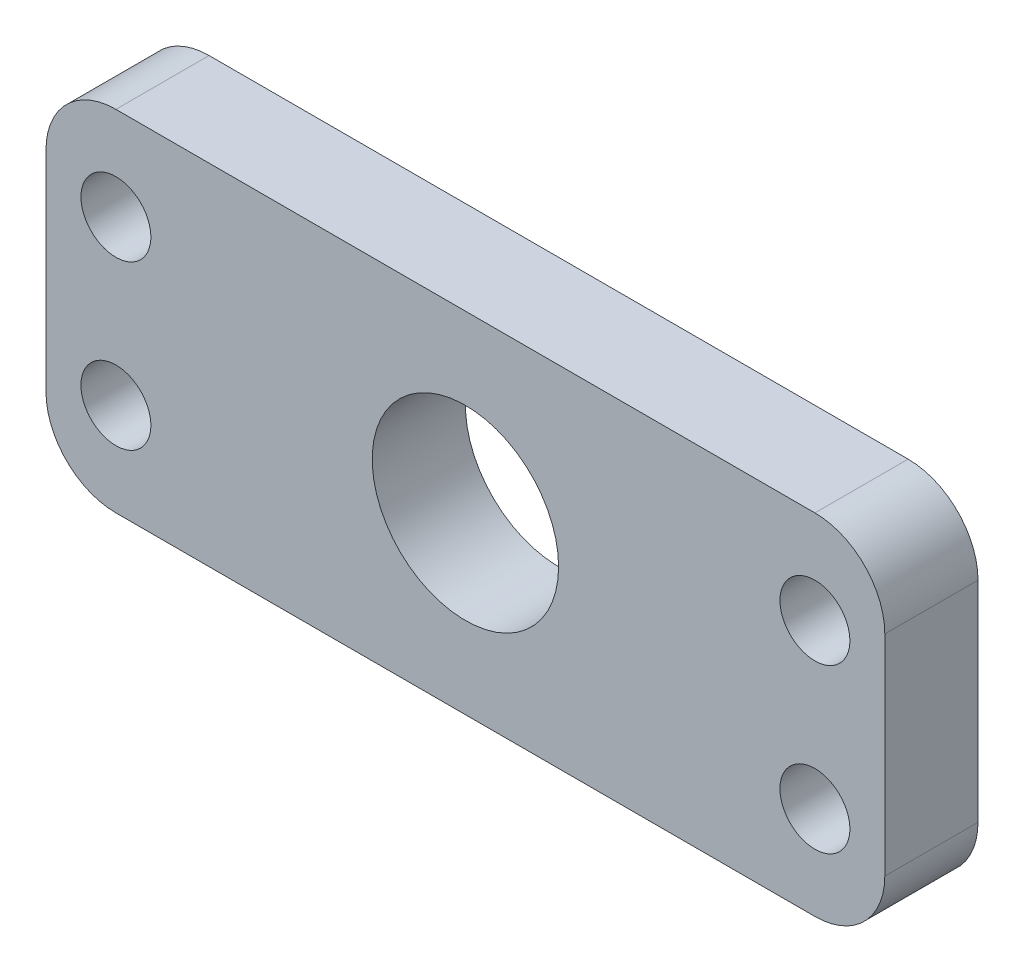
ISO-10303-21;
HEADER;
FILE_DESCRIPTION(('STEP AP214'),'2;1');
FILE_NAME('part.step','',(''),(''),'','','');
FILE_SCHEMA(('AUTOMOTIVE_DESIGN { 1 0 10303 214 1 1 1 1 }'));
ENDSEC;
DATA;
#1=APPLICATION_CONTEXT('core data for automotive mechanical design processes');
#2=APPLICATION_PROTOCOL_DEFINITION('international standard','automotive_design',2000,#1);
#3=PRODUCT_CONTEXT('',#1,'mechanical');
#4=PRODUCT('Part','Part','',(#3));
#5=PRODUCT_RELATED_PRODUCT_CATEGORY('part','',(#4));
#6=PRODUCT_DEFINITION_FORMATION('','',#4);
#7=PRODUCT_DEFINITION_CONTEXT('part definition',#1,'design');
#8=PRODUCT_DEFINITION('design','',#6,#7);
#9=PRODUCT_DEFINITION_SHAPE('','',#8);
#10=(LENGTH_UNIT() NAMED_UNIT(*) SI_UNIT(.MILLI.,.METRE.));
#11=(NAMED_UNIT(*) PLANE_ANGLE_UNIT() SI_UNIT($,.RADIAN.));
#12=(NAMED_UNIT(*) SI_UNIT($,.STERADIAN.) SOLID_ANGLE_UNIT());
#13=UNCERTAINTY_MEASURE_WITH_UNIT(LENGTH_MEASURE(1.E-05),#10,'distance_accuracy_value','');
#14=(GEOMETRIC_REPRESENTATION_CONTEXT(3) GLOBAL_UNCERTAINTY_ASSIGNED_CONTEXT((#13)) GLOBAL_UNIT_ASSIGNED_CONTEXT((#10,
#11,#12)) REPRESENTATION_CONTEXT('',''));
#15=CARTESIAN_POINT('',(0.,0.,0.));
#16=DIRECTION('',(0.,0.,1.));
#17=DIRECTION('',(1.,0.,0.));
#18=AXIS2_PLACEMENT_3D('',#15,#16,#17);
#19=CARTESIAN_POINT('',(-18.,-7.5,4.));
#20=DIRECTION('',(1.,0.,0.));
#21=DIRECTION('',(0.,0.,-1.));
#22=AXIS2_PLACEMENT_3D('',#19,#20,#21);
#23=PLANE('',#22);
#24=DIRECTION('',(0.,-1.,0.));
#25=VECTOR('',#24,1.);
#26=CARTESIAN_POINT('',(-18.,-7.5,0.));
#27=LINE('',#26,#25);
#28=CARTESIAN_POINT('',(-18.,4.49999999999999,0.));
#29=VERTEX_POINT('',#28);
#30=CARTESIAN_POINT('',(-18.,-4.5,0.));
#31=VERTEX_POINT('',#30);
#32=EDGE_CURVE('E141',#29,#31,#27,.T.);
#33=ORIENTED_EDGE('',*,*,#32,.T.);
#34=DIRECTION('',(0.,0.,-1.));
#35=VECTOR('',#34,1.);
#36=CARTESIAN_POINT('',(-18.,-4.5,4.));
#37=LINE('',#36,#35);
#38=CARTESIAN_POINT('',(-18.,-4.5,4.));
#39=VERTEX_POINT('',#38);
#40=EDGE_CURVE('E11',#31,#39,#37,.F.);
#41=ORIENTED_EDGE('',*,*,#40,.T.);
#42=DIRECTION('',(0.,-1.,0.));
#43=VECTOR('',#42,1.);
#44=CARTESIAN_POINT('',(-18.,-7.5,4.));
#45=LINE('',#44,#43);
#46=CARTESIAN_POINT('',(-18.,4.49999999999999,4.));
#47=VERTEX_POINT('',#46);
#48=EDGE_CURVE('E139',#47,#39,#45,.T.);
#49=ORIENTED_EDGE('',*,*,#48,.F.);
#50=DIRECTION('',(0.,0.,-1.));
#51=VECTOR('',#50,1.);
#52=CARTESIAN_POINT('',(-18.,4.5,4.));
#53=LINE('',#52,#51);
#54=EDGE_CURVE('E48',#47,#29,#53,.T.);
#55=ORIENTED_EDGE('',*,*,#54,.T.);
#56=EDGE_LOOP('',(#33,#41,#49,#55));
#57=FACE_BOUND('',#56,.T.);
#58=ADVANCED_FACE('F39',(#57),#23,.F.);
#59=CARTESIAN_POINT('',(-18.,-7.5,4.));
#60=DIRECTION('',(0.,1.,0.));
#61=DIRECTION('',(0.,0.,1.));
#62=AXIS2_PLACEMENT_3D('',#59,#60,#61);
#63=PLANE('',#62);
#64=DIRECTION('',(1.,0.,0.));
#65=VECTOR('',#64,1.);
#66=CARTESIAN_POINT('',(-18.,-7.5,0.));
#67=LINE('',#66,#65);
#68=CARTESIAN_POINT('',(-15.,-7.5,0.));
#69=VERTEX_POINT('',#68);
#70=CARTESIAN_POINT('',(15.,-7.5,0.));
#71=VERTEX_POINT('',#70);
#72=EDGE_CURVE('E135',#69,#71,#67,.T.);
#73=ORIENTED_EDGE('',*,*,#72,.T.);
#74=DIRECTION('',(0.,0.,-1.));
#75=VECTOR('',#74,1.);
#76=CARTESIAN_POINT('',(15.,-7.5,4.));
#77=LINE('',#76,#75);
#78=CARTESIAN_POINT('',(15.,-7.5,4.));
#79=VERTEX_POINT('',#78);
#80=EDGE_CURVE('E111',#71,#79,#77,.F.);
#81=ORIENTED_EDGE('',*,*,#80,.T.);
#82=DIRECTION('',(1.,0.,0.));
#83=VECTOR('',#82,1.);
#84=CARTESIAN_POINT('',(-18.,-7.5,4.));
#85=LINE('',#84,#83);
#86=CARTESIAN_POINT('',(-15.,-7.5,4.));
#87=VERTEX_POINT('',#86);
#88=EDGE_CURVE('E198',#87,#79,#85,.T.);
#89=ORIENTED_EDGE('',*,*,#88,.F.);
#90=DIRECTION('',(0.,0.,-1.));
#91=VECTOR('',#90,1.);
#92=CARTESIAN_POINT('',(-15.,-7.5,4.));
#93=LINE('',#92,#91);
#94=EDGE_CURVE('E117',#87,#69,#93,.T.);
#95=ORIENTED_EDGE('',*,*,#94,.T.);
#96=EDGE_LOOP('',(#73,#81,#89,#95));
#97=FACE_BOUND('',#96,.T.);
#98=ADVANCED_FACE('F273',(#97),#63,.F.);
#99=CARTESIAN_POINT('',(18.,-7.5,4.));
#100=DIRECTION('',(-1.,0.,0.));
#101=DIRECTION('',(0.,0.,1.));
#102=AXIS2_PLACEMENT_3D('',#99,#100,#101);
#103=PLANE('',#102);
#104=DIRECTION('',(0.,1.,0.));
#105=VECTOR('',#104,1.);
#106=CARTESIAN_POINT('',(18.,-7.5,4.));
#107=LINE('',#106,#105);
#108=CARTESIAN_POINT('',(18.,-4.5,4.));
#109=VERTEX_POINT('',#108);
#110=CARTESIAN_POINT('',(18.,4.49999999999999,4.));
#111=VERTEX_POINT('',#110);
#112=EDGE_CURVE('E126',#109,#111,#107,.T.);
#113=ORIENTED_EDGE('',*,*,#112,.F.);
#114=DIRECTION('',(0.,0.,-1.));
#115=VECTOR('',#114,1.);
#116=CARTESIAN_POINT('',(18.,-4.5,4.));
#117=LINE('',#116,#115);
#118=CARTESIAN_POINT('',(18.,-4.5,0.));
#119=VERTEX_POINT('',#118);
#120=EDGE_CURVE('E110',#109,#119,#117,.T.);
#121=ORIENTED_EDGE('',*,*,#120,.T.);
#122=DIRECTION('',(0.,1.,0.));
#123=VECTOR('',#122,1.);
#124=CARTESIAN_POINT('',(18.,-7.5,0.));
#125=LINE('',#124,#123);
#126=CARTESIAN_POINT('',(18.,4.49999999999999,0.));
#127=VERTEX_POINT('',#126);
#128=EDGE_CURVE('E124',#119,#127,#125,.T.);
#129=ORIENTED_EDGE('',*,*,#128,.T.);
#130=DIRECTION('',(0.,0.,-1.));
#131=VECTOR('',#130,1.);
#132=CARTESIAN_POINT('',(18.,4.5,4.));
#133=LINE('',#132,#131);
#134=EDGE_CURVE('E129',#127,#111,#133,.F.);
#135=ORIENTED_EDGE('',*,*,#134,.T.);
#136=EDGE_LOOP('',(#113,#121,#129,#135));
#137=FACE_BOUND('',#136,.T.);
#138=ADVANCED_FACE('F123',(#137),#103,.F.);
#139=CARTESIAN_POINT('',(-18.,7.5,4.));
#140=DIRECTION('',(0.,-1.,0.));
#141=DIRECTION('',(0.,0.,-1.));
#142=AXIS2_PLACEMENT_3D('',#139,#140,#141);
#143=PLANE('',#142);
#144=DIRECTION('',(-1.,0.,0.));
#145=VECTOR('',#144,1.);
#146=CARTESIAN_POINT('',(-18.,7.5,4.));
#147=LINE('',#146,#145);
#148=CARTESIAN_POINT('',(15.,7.5,4.));
#149=VERTEX_POINT('',#148);
#150=CARTESIAN_POINT('',(-15.,7.5,4.));
#151=VERTEX_POINT('',#150);
#152=EDGE_CURVE('E146',#149,#151,#147,.T.);
#153=ORIENTED_EDGE('',*,*,#152,.F.);
#154=DIRECTION('',(0.,0.,-1.));
#155=VECTOR('',#154,1.);
#156=CARTESIAN_POINT('',(15.,7.5,4.));
#157=LINE('',#156,#155);
#158=CARTESIAN_POINT('',(15.,7.5,0.));
#159=VERTEX_POINT('',#158);
#160=EDGE_CURVE('E173',#149,#159,#157,.T.);
#161=ORIENTED_EDGE('',*,*,#160,.T.);
#162=DIRECTION('',(-1.,0.,0.));
#163=VECTOR('',#162,1.);
#164=CARTESIAN_POINT('',(-18.,7.5,0.));
#165=LINE('',#164,#163);
#166=CARTESIAN_POINT('',(-15.,7.5,0.));
#167=VERTEX_POINT('',#166);
#168=EDGE_CURVE('E134',#159,#167,#165,.T.);
#169=ORIENTED_EDGE('',*,*,#168,.T.);
#170=DIRECTION('',(0.,0.,-1.));
#171=VECTOR('',#170,1.);
#172=CARTESIAN_POINT('',(-15.,7.5,4.));
#173=LINE('',#172,#171);
#174=EDGE_CURVE('E55',#167,#151,#173,.F.);
#175=ORIENTED_EDGE('',*,*,#174,.T.);
#176=EDGE_LOOP('',(#153,#161,#169,#175));
#177=FACE_BOUND('',#176,.T.);
#178=ADVANCED_FACE('F266',(#177),#143,.F.);
#179=CARTESIAN_POINT('',(0.,0.,4.));
#180=DIRECTION('',(0.,0.,-1.));
#181=DIRECTION('',(-1.,0.,0.));
#182=AXIS2_PLACEMENT_3D('',#179,#180,#181);
#183=PLANE('',#182);
#184=CARTESIAN_POINT('',(15.,-3.5,4.));
#185=DIRECTION('',(0.,0.,-1.));
#186=DIRECTION('',(-1.,0.,0.));
#187=AXIS2_PLACEMENT_3D('',#184,#185,#186);
#188=CIRCLE('',#187,1.5);
#189=CARTESIAN_POINT('',(13.5,-3.5,4.));
#190=VERTEX_POINT('',#189);
#191=EDGE_CURVE('E220',#190,#190,#188,.T.);
#192=ORIENTED_EDGE('',*,*,#191,.T.);
#193=EDGE_LOOP('',(#192));
#194=FACE_BOUND('',#193,.T.);
#195=CARTESIAN_POINT('',(15.,3.5,4.));
#196=DIRECTION('',(0.,0.,-1.));
#197=DIRECTION('',(-1.,0.,0.));
#198=AXIS2_PLACEMENT_3D('',#195,#196,#197);
#199=CIRCLE('',#198,1.5);
#200=CARTESIAN_POINT('',(13.5,3.5,4.));
#201=VERTEX_POINT('',#200);
#202=EDGE_CURVE('E228',#201,#201,#199,.T.);
#203=ORIENTED_EDGE('',*,*,#202,.T.);
#204=EDGE_LOOP('',(#203));
#205=FACE_BOUND('',#204,.T.);
#206=CARTESIAN_POINT('',(-15.,3.5,4.));
#207=DIRECTION('',(0.,0.,-1.));
#208=DIRECTION('',(-1.,0.,0.));
#209=AXIS2_PLACEMENT_3D('',#206,#207,#208);
#210=CIRCLE('',#209,1.5);
#211=CARTESIAN_POINT('',(-16.5,3.5,4.));
#212=VERTEX_POINT('',#211);
#213=EDGE_CURVE('E212',#212,#212,#210,.T.);
#214=ORIENTED_EDGE('',*,*,#213,.T.);
#215=EDGE_LOOP('',(#214));
#216=FACE_BOUND('',#215,.T.);
#217=CARTESIAN_POINT('',(-15.,-3.5,4.));
#218=DIRECTION('',(0.,0.,-1.));
#219=DIRECTION('',(-1.,0.,0.));
#220=AXIS2_PLACEMENT_3D('',#217,#218,#219);
#221=CIRCLE('',#220,1.5);
#222=CARTESIAN_POINT('',(-16.5,-3.5,4.));
#223=VERTEX_POINT('',#222);
#224=EDGE_CURVE('E206',#223,#223,#221,.T.);
#225=ORIENTED_EDGE('',*,*,#224,.T.);
#226=EDGE_LOOP('',(#225));
#227=FACE_BOUND('',#226,.T.);
#228=CARTESIAN_POINT('',(0.,0.,4.));
#229=DIRECTION('',(0.,0.,1.));
#230=DIRECTION('',(1.,0.,0.));
#231=AXIS2_PLACEMENT_3D('',#228,#229,#230);
#232=CIRCLE('',#231,4.);
#233=CARTESIAN_POINT('',(4.,0.,4.));
#234=VERTEX_POINT('',#233);
#235=EDGE_CURVE('E191',#234,#234,#232,.T.);
#236=ORIENTED_EDGE('',*,*,#235,.F.);
#237=EDGE_LOOP('',(#236));
#238=FACE_BOUND('',#237,.T.);
#239=ORIENTED_EDGE('',*,*,#88,.T.);
#240=CARTESIAN_POINT('',(15.,-4.5,4.));
#241=DIRECTION('',(0.,0.,-1.));
#242=DIRECTION('',(-1.,0.,0.));
#243=AXIS2_PLACEMENT_3D('',#240,#241,#242);
#244=CIRCLE('',#243,3.);
#245=EDGE_CURVE('E168',#79,#109,#244,.F.);
#246=ORIENTED_EDGE('',*,*,#245,.T.);
#247=ORIENTED_EDGE('',*,*,#112,.T.);
#248=CARTESIAN_POINT('',(15.,4.5,4.));
#249=DIRECTION('',(0.,0.,-1.));
#250=DIRECTION('',(-1.,0.,0.));
#251=AXIS2_PLACEMENT_3D('',#248,#249,#250);
#252=CIRCLE('',#251,3.);
#253=EDGE_CURVE('E62',#111,#149,#252,.F.);
#254=ORIENTED_EDGE('',*,*,#253,.T.);
#255=ORIENTED_EDGE('',*,*,#152,.T.);
#256=CARTESIAN_POINT('',(-15.,4.5,4.));
#257=DIRECTION('',(0.,0.,-1.));
#258=DIRECTION('',(-1.,0.,0.));
#259=AXIS2_PLACEMENT_3D('',#256,#257,#258);
#260=CIRCLE('',#259,3.);
#261=EDGE_CURVE('E160',#151,#47,#260,.F.);
#262=ORIENTED_EDGE('',*,*,#261,.T.);
#263=ORIENTED_EDGE('',*,*,#48,.T.);
#264=CARTESIAN_POINT('',(-15.,-4.5,4.));
#265=DIRECTION('',(0.,0.,-1.));
#266=DIRECTION('',(-1.,0.,0.));
#267=AXIS2_PLACEMENT_3D('',#264,#265,#266);
#268=CIRCLE('',#267,3.);
#269=EDGE_CURVE('E163',#39,#87,#268,.F.);
#270=ORIENTED_EDGE('',*,*,#269,.T.);
#271=EDGE_LOOP('',(#239,#246,#247,#254,#255,#262,#263,#270));
#272=FACE_BOUND('',#271,.T.);
#273=ADVANCED_FACE('F240',(#194,#205,#216,#227,#238,#272),#183,.F.);
#274=CARTESIAN_POINT('',(0.,0.,0.));
#275=DIRECTION('',(0.,0.,-1.));
#276=DIRECTION('',(-1.,0.,0.));
#277=AXIS2_PLACEMENT_3D('',#274,#275,#276);
#278=PLANE('',#277);
#279=CARTESIAN_POINT('',(15.,-3.5,0.));
#280=DIRECTION('',(0.,0.,-1.));
#281=DIRECTION('',(-1.,0.,0.));
#282=AXIS2_PLACEMENT_3D('',#279,#280,#281);
#283=CIRCLE('',#282,1.5);
#284=CARTESIAN_POINT('',(13.5,-3.5,0.));
#285=VERTEX_POINT('',#284);
#286=EDGE_CURVE('E216',#285,#285,#283,.T.);
#287=ORIENTED_EDGE('',*,*,#286,.F.);
#288=EDGE_LOOP('',(#287));
#289=FACE_BOUND('',#288,.T.);
#290=CARTESIAN_POINT('',(15.,3.5,0.));
#291=DIRECTION('',(0.,0.,-1.));
#292=DIRECTION('',(-1.,0.,0.));
#293=AXIS2_PLACEMENT_3D('',#290,#291,#292);
#294=CIRCLE('',#293,1.5);
#295=CARTESIAN_POINT('',(13.5,3.5,0.));
#296=VERTEX_POINT('',#295);
#297=EDGE_CURVE('E224',#296,#296,#294,.T.);
#298=ORIENTED_EDGE('',*,*,#297,.F.);
#299=EDGE_LOOP('',(#298));
#300=FACE_BOUND('',#299,.T.);
#301=CARTESIAN_POINT('',(-15.,3.5,0.));
#302=DIRECTION('',(0.,0.,-1.));
#303=DIRECTION('',(-1.,0.,0.));
#304=AXIS2_PLACEMENT_3D('',#301,#302,#303);
#305=CIRCLE('',#304,1.5);
#306=CARTESIAN_POINT('',(-16.5,3.5,0.));
#307=VERTEX_POINT('',#306);
#308=EDGE_CURVE('E232',#307,#307,#305,.T.);
#309=ORIENTED_EDGE('',*,*,#308,.F.);
#310=EDGE_LOOP('',(#309));
#311=FACE_BOUND('',#310,.T.);
#312=CARTESIAN_POINT('',(-15.,-3.5,0.));
#313=DIRECTION('',(0.,0.,-1.));
#314=DIRECTION('',(-1.,0.,0.));
#315=AXIS2_PLACEMENT_3D('',#312,#313,#314);
#316=CIRCLE('',#315,1.5);
#317=CARTESIAN_POINT('',(-16.5,-3.5,0.));
#318=VERTEX_POINT('',#317);
#319=EDGE_CURVE('E208',#318,#318,#316,.T.);
#320=ORIENTED_EDGE('',*,*,#319,.F.);
#321=EDGE_LOOP('',(#320));
#322=FACE_BOUND('',#321,.T.);
#323=CARTESIAN_POINT('',(0.,0.,0.));
#324=DIRECTION('',(0.,0.,1.));
#325=DIRECTION('',(1.,0.,0.));
#326=AXIS2_PLACEMENT_3D('',#323,#324,#325);
#327=CIRCLE('',#326,4.);
#328=CARTESIAN_POINT('',(4.,0.,0.));
#329=VERTEX_POINT('',#328);
#330=EDGE_CURVE('E188',#329,#329,#327,.T.);
#331=ORIENTED_EDGE('',*,*,#330,.T.);
#332=EDGE_LOOP('',(#331));
#333=FACE_BOUND('',#332,.T.);
#334=ORIENTED_EDGE('',*,*,#128,.F.);
#335=CARTESIAN_POINT('',(15.,-4.5,0.));
#336=DIRECTION('',(0.,0.,-1.));
#337=DIRECTION('',(-1.,0.,0.));
#338=AXIS2_PLACEMENT_3D('',#335,#336,#337);
#339=CIRCLE('',#338,3.);
#340=EDGE_CURVE('E106',#119,#71,#339,.T.);
#341=ORIENTED_EDGE('',*,*,#340,.T.);
#342=ORIENTED_EDGE('',*,*,#72,.F.);
#343=CARTESIAN_POINT('',(-15.,-4.5,0.));
#344=DIRECTION('',(0.,0.,-1.));
#345=DIRECTION('',(-1.,0.,0.));
#346=AXIS2_PLACEMENT_3D('',#343,#344,#345);
#347=CIRCLE('',#346,3.);
#348=EDGE_CURVE('E150',#69,#31,#347,.T.);
#349=ORIENTED_EDGE('',*,*,#348,.T.);
#350=ORIENTED_EDGE('',*,*,#32,.F.);
#351=CARTESIAN_POINT('',(-15.,4.5,0.));
#352=DIRECTION('',(0.,0.,-1.));
#353=DIRECTION('',(-1.,0.,0.));
#354=AXIS2_PLACEMENT_3D('',#351,#352,#353);
#355=CIRCLE('',#354,3.);
#356=EDGE_CURVE('E128',#29,#167,#355,.T.);
#357=ORIENTED_EDGE('',*,*,#356,.T.);
#358=ORIENTED_EDGE('',*,*,#168,.F.);
#359=CARTESIAN_POINT('',(15.,4.5,0.));
#360=DIRECTION('',(0.,0.,-1.));
#361=DIRECTION('',(-1.,0.,0.));
#362=AXIS2_PLACEMENT_3D('',#359,#360,#361);
#363=CIRCLE('',#362,3.);
#364=EDGE_CURVE('E118',#159,#127,#363,.T.);
#365=ORIENTED_EDGE('',*,*,#364,.T.);
#366=EDGE_LOOP('',(#334,#341,#342,#349,#350,#357,#358,#365));
#367=FACE_BOUND('',#366,.T.);
#368=ADVANCED_FACE('F131',(#289,#300,#311,#322,#333,#367),#278,.T.);
#369=CARTESIAN_POINT('',(0.,0.,0.));
#370=DIRECTION('',(0.,0.,1.));
#371=DIRECTION('',(1.,0.,0.));
#372=AXIS2_PLACEMENT_3D('',#369,#370,#371);
#373=CYLINDRICAL_SURFACE('',#372,4.);
#374=ORIENTED_EDGE('',*,*,#330,.F.);
#375=EDGE_LOOP('',(#374));
#376=FACE_BOUND('',#375,.T.);
#377=ORIENTED_EDGE('',*,*,#235,.T.);
#378=EDGE_LOOP('',(#377));
#379=FACE_BOUND('',#378,.T.);
#380=ADVANCED_FACE('F253',(#376,#379),#373,.F.);
#381=CARTESIAN_POINT('',(-15.,-3.5,4.));
#382=DIRECTION('',(0.,0.,-1.));
#383=DIRECTION('',(-1.,0.,0.));
#384=AXIS2_PLACEMENT_3D('',#381,#382,#383);
#385=CYLINDRICAL_SURFACE('',#384,1.5);
#386=ORIENTED_EDGE('',*,*,#224,.F.);
#387=EDGE_LOOP('',(#386));
#388=FACE_BOUND('',#387,.T.);
#389=ORIENTED_EDGE('',*,*,#319,.T.);
#390=EDGE_LOOP('',(#389));
#391=FACE_BOUND('',#390,.T.);
#392=ADVANCED_FACE('F247',(#388,#391),#385,.F.);
#393=CARTESIAN_POINT('',(-15.,3.5,4.));
#394=DIRECTION('',(0.,0.,-1.));
#395=DIRECTION('',(-1.,0.,0.));
#396=AXIS2_PLACEMENT_3D('',#393,#394,#395);
#397=CYLINDRICAL_SURFACE('',#396,1.5);
#398=ORIENTED_EDGE('',*,*,#213,.F.);
#399=EDGE_LOOP('',(#398));
#400=FACE_BOUND('',#399,.T.);
#401=ORIENTED_EDGE('',*,*,#308,.T.);
#402=EDGE_LOOP('',(#401));
#403=FACE_BOUND('',#402,.T.);
#404=ADVANCED_FACE('F243',(#400,#403),#397,.F.);
#405=CARTESIAN_POINT('',(15.,3.5,4.));
#406=DIRECTION('',(0.,0.,-1.));
#407=DIRECTION('',(-1.,0.,0.));
#408=AXIS2_PLACEMENT_3D('',#405,#406,#407);
#409=CYLINDRICAL_SURFACE('',#408,1.5);
#410=ORIENTED_EDGE('',*,*,#202,.F.);
#411=EDGE_LOOP('',(#410));
#412=FACE_BOUND('',#411,.T.);
#413=ORIENTED_EDGE('',*,*,#297,.T.);
#414=EDGE_LOOP('',(#413));
#415=FACE_BOUND('',#414,.T.);
#416=ADVANCED_FACE('F246',(#412,#415),#409,.F.);
#417=CARTESIAN_POINT('',(15.,-3.5,4.));
#418=DIRECTION('',(0.,0.,-1.));
#419=DIRECTION('',(-1.,0.,0.));
#420=AXIS2_PLACEMENT_3D('',#417,#418,#419);
#421=CYLINDRICAL_SURFACE('',#420,1.5);
#422=ORIENTED_EDGE('',*,*,#191,.F.);
#423=EDGE_LOOP('',(#422));
#424=FACE_BOUND('',#423,.T.);
#425=ORIENTED_EDGE('',*,*,#286,.T.);
#426=EDGE_LOOP('',(#425));
#427=FACE_BOUND('',#426,.T.);
#428=ADVANCED_FACE('F291',(#424,#427),#421,.F.);
#429=CARTESIAN_POINT('',(15.,-4.5,4.));
#430=DIRECTION('',(0.,0.,-1.));
#431=DIRECTION('',(-1.,0.,0.));
#432=AXIS2_PLACEMENT_3D('',#429,#430,#431);
#433=CYLINDRICAL_SURFACE('',#432,3.);
#434=ORIENTED_EDGE('',*,*,#245,.F.);
#435=ORIENTED_EDGE('',*,*,#80,.F.);
#436=ORIENTED_EDGE('',*,*,#340,.F.);
#437=ORIENTED_EDGE('',*,*,#120,.F.);
#438=EDGE_LOOP('',(#434,#435,#436,#437));
#439=FACE_BOUND('',#438,.T.);
#440=ADVANCED_FACE('F109',(#439),#433,.T.);
#441=CARTESIAN_POINT('',(15.,4.5,4.));
#442=DIRECTION('',(0.,0.,-1.));
#443=DIRECTION('',(-1.,0.,0.));
#444=AXIS2_PLACEMENT_3D('',#441,#442,#443);
#445=CYLINDRICAL_SURFACE('',#444,3.);
#446=ORIENTED_EDGE('',*,*,#253,.F.);
#447=ORIENTED_EDGE('',*,*,#134,.F.);
#448=ORIENTED_EDGE('',*,*,#364,.F.);
#449=ORIENTED_EDGE('',*,*,#160,.F.);
#450=EDGE_LOOP('',(#446,#447,#448,#449));
#451=FACE_BOUND('',#450,.T.);
#452=ADVANCED_FACE('F280',(#451),#445,.T.);
#453=CARTESIAN_POINT('',(-15.,-4.5,4.));
#454=DIRECTION('',(0.,0.,-1.));
#455=DIRECTION('',(-1.,0.,0.));
#456=AXIS2_PLACEMENT_3D('',#453,#454,#455);
#457=CYLINDRICAL_SURFACE('',#456,3.);
#458=ORIENTED_EDGE('',*,*,#269,.F.);
#459=ORIENTED_EDGE('',*,*,#40,.F.);
#460=ORIENTED_EDGE('',*,*,#348,.F.);
#461=ORIENTED_EDGE('',*,*,#94,.F.);
#462=EDGE_LOOP('',(#458,#459,#460,#461));
#463=FACE_BOUND('',#462,.T.);
#464=ADVANCED_FACE('F275',(#463),#457,.T.);
#465=CARTESIAN_POINT('',(-15.,4.5,4.));
#466=DIRECTION('',(0.,0.,-1.));
#467=DIRECTION('',(-1.,0.,0.));
#468=AXIS2_PLACEMENT_3D('',#465,#466,#467);
#469=CYLINDRICAL_SURFACE('',#468,3.);
#470=ORIENTED_EDGE('',*,*,#261,.F.);
#471=ORIENTED_EDGE('',*,*,#174,.F.);
#472=ORIENTED_EDGE('',*,*,#356,.F.);
#473=ORIENTED_EDGE('',*,*,#54,.F.);
#474=EDGE_LOOP('',(#470,#471,#472,#473));
#475=FACE_BOUND('',#474,.T.);
#476=ADVANCED_FACE('F41',(#475),#469,.T.);
#477=CLOSED_SHELL('',(#58,#98,#138,#178,#273,#368,#380,#392,#404,#416,#428,#440,#452,#464,#476));
#478=MANIFOLD_SOLID_BREP('B2',#477);
#479=ADVANCED_BREP_SHAPE_REPRESENTATION('',(#18,#478),#14);
#480=SHAPE_DEFINITION_REPRESENTATION(#9,#479);
ENDSEC;
END-ISO-10303-21;
